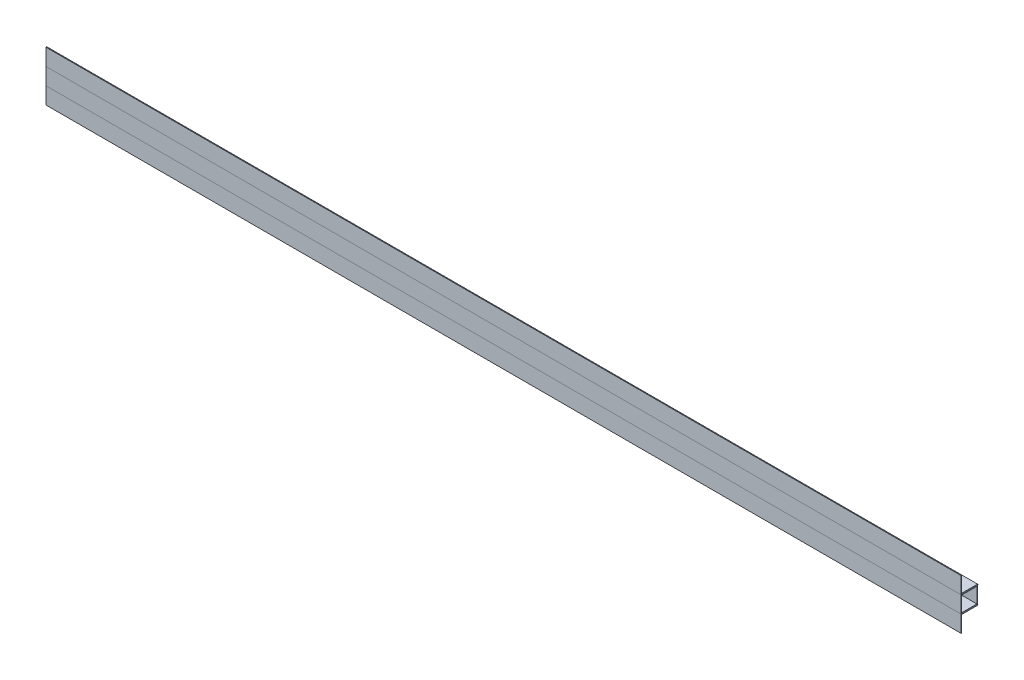
ISO-10303-21;
HEADER;
FILE_DESCRIPTION(('STEP AP214'),'2;1');
FILE_NAME('part.step','',(''),(''),'','','');
FILE_SCHEMA(('AUTOMOTIVE_DESIGN { 1 0 10303 214 1 1 1 1 }'));
ENDSEC;
DATA;
#1=APPLICATION_CONTEXT('core data for automotive mechanical design processes');
#2=APPLICATION_PROTOCOL_DEFINITION('international standard','automotive_design',2000,#1);
#3=PRODUCT_CONTEXT('',#1,'mechanical');
#4=PRODUCT('Part','Part','',(#3));
#5=PRODUCT_RELATED_PRODUCT_CATEGORY('part','',(#4));
#6=PRODUCT_DEFINITION_FORMATION('','',#4);
#7=PRODUCT_DEFINITION_CONTEXT('part definition',#1,'design');
#8=PRODUCT_DEFINITION('design','',#6,#7);
#9=PRODUCT_DEFINITION_SHAPE('','',#8);
#10=(LENGTH_UNIT() NAMED_UNIT(*) SI_UNIT(.MILLI.,.METRE.));
#11=(NAMED_UNIT(*) PLANE_ANGLE_UNIT() SI_UNIT($,.RADIAN.));
#12=(NAMED_UNIT(*) SI_UNIT($,.STERADIAN.) SOLID_ANGLE_UNIT());
#13=UNCERTAINTY_MEASURE_WITH_UNIT(LENGTH_MEASURE(1.E-05),#10,'distance_accuracy_value','');
#14=(GEOMETRIC_REPRESENTATION_CONTEXT(3) GLOBAL_UNCERTAINTY_ASSIGNED_CONTEXT((#13)) GLOBAL_UNIT_ASSIGNED_CONTEXT((#10,
#11,#12)) REPRESENTATION_CONTEXT('',''));
#15=CARTESIAN_POINT('',(0.,0.,0.));
#16=DIRECTION('',(0.,0.,1.));
#17=DIRECTION('',(1.,0.,0.));
#18=AXIS2_PLACEMENT_3D('',#15,#16,#17);
#19=CARTESIAN_POINT('',(1392.049939,-13.95,11.45));
#20=DIRECTION('',(0.,-1.,0.));
#21=DIRECTION('',(0.,0.,-1.));
#22=AXIS2_PLACEMENT_3D('',#19,#20,#21);
#23=PLANE('',#22);
#24=DIRECTION('',(0.,0.,1.));
#25=VECTOR('',#24,1.);
#26=CARTESIAN_POINT('',(0.,-13.95,11.45));
#27=LINE('',#26,#25);
#28=CARTESIAN_POINT('',(0.,-13.95,-12.7));
#29=VERTEX_POINT('',#28);
#30=CARTESIAN_POINT('',(0.,-13.95,11.45));
#31=VERTEX_POINT('',#30);
#32=EDGE_CURVE('E214',#29,#31,#27,.T.);
#33=ORIENTED_EDGE('',*,*,#32,.F.);
#34=DIRECTION('',(-1.,0.,0.));
#35=VECTOR('',#34,1.);
#36=CARTESIAN_POINT('',(1392.049939,-13.95,-12.7));
#37=LINE('',#36,#35);
#38=CARTESIAN_POINT('',(1392.049939,-13.95,-12.7));
#39=VERTEX_POINT('',#38);
#40=EDGE_CURVE('E14',#39,#29,#37,.T.);
#41=ORIENTED_EDGE('',*,*,#40,.F.);
#42=DIRECTION('',(0.,0.,1.));
#43=VECTOR('',#42,1.);
#44=CARTESIAN_POINT('',(1392.049939,-13.95,11.45));
#45=LINE('',#44,#43);
#46=CARTESIAN_POINT('',(1392.049939,-13.95,11.45));
#47=VERTEX_POINT('',#46);
#48=EDGE_CURVE('E234',#39,#47,#45,.T.);
#49=ORIENTED_EDGE('',*,*,#48,.T.);
#50=DIRECTION('',(-1.,0.,0.));
#51=VECTOR('',#50,1.);
#52=CARTESIAN_POINT('',(1392.049939,-13.95,11.45));
#53=LINE('',#52,#51);
#54=EDGE_CURVE('E120',#47,#31,#53,.T.);
#55=ORIENTED_EDGE('',*,*,#54,.T.);
#56=EDGE_LOOP('',(#33,#41,#49,#55));
#57=FACE_BOUND('',#56,.T.);
#58=ADVANCED_FACE('F117',(#57),#23,.T.);
#59=CARTESIAN_POINT('',(1392.049939,-13.325,-13.325));
#60=DIRECTION('',(0.,-0.707106781186546,-0.707106781186549));
#61=DIRECTION('',(0.,0.707106781186549,-0.707106781186546));
#62=AXIS2_PLACEMENT_3D('',#59,#60,#61);
#63=PLANE('',#62);
#64=DIRECTION('',(0.,-0.707106781186549,0.707106781186546));
#65=VECTOR('',#64,1.);
#66=CARTESIAN_POINT('',(0.,-13.325,-13.325));
#67=LINE('',#66,#65);
#68=CARTESIAN_POINT('',(0.,-13.325,-13.325));
#69=VERTEX_POINT('',#68);
#70=EDGE_CURVE('E232',#69,#29,#67,.T.);
#71=ORIENTED_EDGE('',*,*,#70,.F.);
#72=DIRECTION('',(-1.,0.,0.));
#73=VECTOR('',#72,1.);
#74=CARTESIAN_POINT('',(1392.049939,-13.325,-13.325));
#75=LINE('',#74,#73);
#76=CARTESIAN_POINT('',(1392.049939,-13.325,-13.325));
#77=VERTEX_POINT('',#76);
#78=EDGE_CURVE('E126',#77,#69,#75,.T.);
#79=ORIENTED_EDGE('',*,*,#78,.F.);
#80=DIRECTION('',(0.,-0.707106781186549,0.707106781186546));
#81=VECTOR('',#80,1.);
#82=CARTESIAN_POINT('',(1392.049939,-13.325,-13.325));
#83=LINE('',#82,#81);
#84=EDGE_CURVE('E204',#77,#39,#83,.T.);
#85=ORIENTED_EDGE('',*,*,#84,.T.);
#86=ORIENTED_EDGE('',*,*,#40,.T.);
#87=EDGE_LOOP('',(#71,#79,#85,#86));
#88=FACE_BOUND('',#87,.T.);
#89=ADVANCED_FACE('F246',(#88),#63,.T.);
#90=CARTESIAN_POINT('',(1392.049939,-13.325,-13.325));
#91=DIRECTION('',(0.,0.707106781186544,-0.707106781186551));
#92=DIRECTION('',(0.,0.707106781186551,0.707106781186544));
#93=AXIS2_PLACEMENT_3D('',#90,#91,#92);
#94=PLANE('',#93);
#95=DIRECTION('',(0.,-0.707106781186551,-0.707106781186544));
#96=VECTOR('',#95,1.);
#97=CARTESIAN_POINT('',(0.,-13.325,-13.325));
#98=LINE('',#97,#96);
#99=CARTESIAN_POINT('',(0.,-12.7,-12.7));
#100=VERTEX_POINT('',#99);
#101=EDGE_CURVE('E191',#100,#69,#98,.T.);
#102=ORIENTED_EDGE('',*,*,#101,.F.);
#103=DIRECTION('',(-1.,0.,0.));
#104=VECTOR('',#103,1.);
#105=CARTESIAN_POINT('',(1392.049939,-12.7,-12.7));
#106=LINE('',#105,#104);
#107=CARTESIAN_POINT('',(1392.049939,-12.7,-12.7));
#108=VERTEX_POINT('',#107);
#109=EDGE_CURVE('E186',#108,#100,#106,.T.);
#110=ORIENTED_EDGE('',*,*,#109,.F.);
#111=DIRECTION('',(0.,-0.707106781186551,-0.707106781186544));
#112=VECTOR('',#111,1.);
#113=CARTESIAN_POINT('',(1392.049939,-13.325,-13.325));
#114=LINE('',#113,#112);
#115=EDGE_CURVE('E189',#108,#77,#114,.T.);
#116=ORIENTED_EDGE('',*,*,#115,.T.);
#117=ORIENTED_EDGE('',*,*,#78,.T.);
#118=EDGE_LOOP('',(#102,#110,#116,#117));
#119=FACE_BOUND('',#118,.T.);
#120=ADVANCED_FACE('F188',(#119),#94,.T.);
#121=CARTESIAN_POINT('',(1392.049939,-12.7,-12.7));
#122=DIRECTION('',(0.,1.,0.));
#123=DIRECTION('',(0.,0.,1.));
#124=AXIS2_PLACEMENT_3D('',#121,#122,#123);
#125=PLANE('',#124);
#126=DIRECTION('',(0.,0.,-1.));
#127=VECTOR('',#126,1.);
#128=CARTESIAN_POINT('',(0.,-12.7,-12.7));
#129=LINE('',#128,#127);
#130=CARTESIAN_POINT('',(0.,-12.7,12.7));
#131=VERTEX_POINT('',#130);
#132=EDGE_CURVE('E229',#131,#100,#129,.T.);
#133=ORIENTED_EDGE('',*,*,#132,.F.);
#134=DIRECTION('',(-1.,0.,0.));
#135=VECTOR('',#134,1.);
#136=CARTESIAN_POINT('',(1392.049939,-12.7,12.7));
#137=LINE('',#136,#135);
#138=CARTESIAN_POINT('',(1392.049939,-12.7,12.7));
#139=VERTEX_POINT('',#138);
#140=EDGE_CURVE('E196',#139,#131,#137,.T.);
#141=ORIENTED_EDGE('',*,*,#140,.F.);
#142=DIRECTION('',(0.,0.,-1.));
#143=VECTOR('',#142,1.);
#144=CARTESIAN_POINT('',(1392.049939,-12.7,-12.7));
#145=LINE('',#144,#143);
#146=EDGE_CURVE('E202',#139,#108,#145,.T.);
#147=ORIENTED_EDGE('',*,*,#146,.T.);
#148=ORIENTED_EDGE('',*,*,#109,.T.);
#149=EDGE_LOOP('',(#133,#141,#147,#148));
#150=FACE_BOUND('',#149,.T.);
#151=ADVANCED_FACE('F206',(#150),#125,.T.);
#152=CARTESIAN_POINT('',(1392.049939,-12.7,12.7));
#153=DIRECTION('',(0.,0.,1.));
#154=DIRECTION('',(0.,-1.,0.));
#155=AXIS2_PLACEMENT_3D('',#152,#153,#154);
#156=PLANE('',#155);
#157=DIRECTION('',(0.,1.,0.));
#158=VECTOR('',#157,1.);
#159=CARTESIAN_POINT('',(0.,-12.7,12.7));
#160=LINE('',#159,#158);
#161=CARTESIAN_POINT('',(-1.77335599430191E-13,-38.1,12.7));
#162=VERTEX_POINT('',#161);
#163=EDGE_CURVE('E226',#162,#131,#160,.T.);
#164=ORIENTED_EDGE('',*,*,#163,.F.);
#165=DIRECTION('',(-1.,0.,0.));
#166=VECTOR('',#165,1.);
#167=CARTESIAN_POINT('',(1392.049939,-38.1,12.7));
#168=LINE('',#167,#166);
#169=CARTESIAN_POINT('',(1392.049939,-38.1,12.7));
#170=VERTEX_POINT('',#169);
#171=EDGE_CURVE('E238',#170,#162,#168,.T.);
#172=ORIENTED_EDGE('',*,*,#171,.F.);
#173=DIRECTION('',(0.,1.,0.));
#174=VECTOR('',#173,1.);
#175=CARTESIAN_POINT('',(1392.049939,-12.7,12.7));
#176=LINE('',#175,#174);
#177=EDGE_CURVE('E207',#170,#139,#176,.T.);
#178=ORIENTED_EDGE('',*,*,#177,.T.);
#179=ORIENTED_EDGE('',*,*,#140,.T.);
#180=EDGE_LOOP('',(#164,#172,#178,#179));
#181=FACE_BOUND('',#180,.T.);
#182=ADVANCED_FACE('F259',(#181),#156,.T.);
#183=CARTESIAN_POINT('',(1392.049939,-38.725,12.075));
#184=DIRECTION('',(0.,-0.707106781186547,0.707106781186548));
#185=DIRECTION('',(0.,-0.707106781186548,-0.707106781186547));
#186=AXIS2_PLACEMENT_3D('',#183,#184,#185);
#187=PLANE('',#186);
#188=DIRECTION('',(0.,0.707106781186548,0.707106781186547));
#189=VECTOR('',#188,1.);
#190=CARTESIAN_POINT('',(-1.81699172250816E-13,-38.725,12.075));
#191=LINE('',#190,#189);
#192=CARTESIAN_POINT('',(-1.81699172250816E-13,-38.725,12.075));
#193=VERTEX_POINT('',#192);
#194=EDGE_CURVE('E223',#193,#162,#191,.T.);
#195=ORIENTED_EDGE('',*,*,#194,.F.);
#196=DIRECTION('',(-1.,0.,0.));
#197=VECTOR('',#196,1.);
#198=CARTESIAN_POINT('',(1392.049939,-38.725,12.075));
#199=LINE('',#198,#197);
#200=CARTESIAN_POINT('',(1392.049939,-38.725,12.075));
#201=VERTEX_POINT('',#200);
#202=EDGE_CURVE('E240',#201,#193,#199,.T.);
#203=ORIENTED_EDGE('',*,*,#202,.F.);
#204=DIRECTION('',(0.,0.707106781186548,0.707106781186547));
#205=VECTOR('',#204,1.);
#206=CARTESIAN_POINT('',(1392.049939,-38.725,12.075));
#207=LINE('',#206,#205);
#208=EDGE_CURVE('E209',#201,#170,#207,.T.);
#209=ORIENTED_EDGE('',*,*,#208,.T.);
#210=ORIENTED_EDGE('',*,*,#171,.T.);
#211=EDGE_LOOP('',(#195,#203,#209,#210));
#212=FACE_BOUND('',#211,.T.);
#213=ADVANCED_FACE('F262',(#212),#187,.T.);
#214=CARTESIAN_POINT('',(1392.049939,-38.725,12.075));
#215=DIRECTION('',(0.,-0.707106781186547,-0.707106781186548));
#216=DIRECTION('',(0.,0.707106781186548,-0.707106781186547));
#217=AXIS2_PLACEMENT_3D('',#214,#215,#216);
#218=PLANE('',#217);
#219=DIRECTION('',(0.,-0.707106781186548,0.707106781186547));
#220=VECTOR('',#219,1.);
#221=CARTESIAN_POINT('',(-1.81699172250816E-13,-38.725,12.075));
#222=LINE('',#221,#220);
#223=CARTESIAN_POINT('',(-1.77335599430191E-13,-38.1,11.45));
#224=VERTEX_POINT('',#223);
#225=EDGE_CURVE('E220',#224,#193,#222,.T.);
#226=ORIENTED_EDGE('',*,*,#225,.F.);
#227=DIRECTION('',(-1.,0.,0.));
#228=VECTOR('',#227,1.);
#229=CARTESIAN_POINT('',(1392.049939,-38.1,11.45));
#230=LINE('',#229,#228);
#231=CARTESIAN_POINT('',(1392.049939,-38.1,11.45));
#232=VERTEX_POINT('',#231);
#233=EDGE_CURVE('E241',#232,#224,#230,.T.);
#234=ORIENTED_EDGE('',*,*,#233,.F.);
#235=DIRECTION('',(0.,-0.707106781186548,0.707106781186547));
#236=VECTOR('',#235,1.);
#237=CARTESIAN_POINT('',(1392.049939,-38.725,12.075));
#238=LINE('',#237,#236);
#239=EDGE_CURVE('E377',#232,#201,#238,.T.);
#240=ORIENTED_EDGE('',*,*,#239,.T.);
#241=ORIENTED_EDGE('',*,*,#202,.T.);
#242=EDGE_LOOP('',(#226,#234,#240,#241));
#243=FACE_BOUND('',#242,.T.);
#244=ADVANCED_FACE('F266',(#243),#218,.T.);
#245=CARTESIAN_POINT('',(1392.049939,-38.1,11.45));
#246=DIRECTION('',(0.,0.,-1.));
#247=DIRECTION('',(0.,1.,0.));
#248=AXIS2_PLACEMENT_3D('',#245,#246,#247);
#249=PLANE('',#248);
#250=DIRECTION('',(0.,-1.,0.));
#251=VECTOR('',#250,1.);
#252=CARTESIAN_POINT('',(-1.77335599430191E-13,-38.1,11.45));
#253=LINE('',#252,#251);
#254=EDGE_CURVE('E217',#31,#224,#253,.T.);
#255=ORIENTED_EDGE('',*,*,#254,.F.);
#256=ORIENTED_EDGE('',*,*,#54,.F.);
#257=DIRECTION('',(0.,-1.,0.));
#258=VECTOR('',#257,1.);
#259=CARTESIAN_POINT('',(1392.049939,-38.1,11.45));
#260=LINE('',#259,#258);
#261=EDGE_CURVE('E378',#47,#232,#260,.T.);
#262=ORIENTED_EDGE('',*,*,#261,.T.);
#263=ORIENTED_EDGE('',*,*,#233,.T.);
#264=EDGE_LOOP('',(#255,#256,#262,#263));
#265=FACE_BOUND('',#264,.T.);
#266=ADVANCED_FACE('F243',(#265),#249,.T.);
#267=CARTESIAN_POINT('',(1392.049939,0.,12.7));
#268=DIRECTION('',(-1.,0.,0.));
#269=DIRECTION('',(0.,1.,0.));
#270=AXIS2_PLACEMENT_3D('',#267,#268,#269);
#271=PLANE('',#270);
#272=ORIENTED_EDGE('',*,*,#48,.F.);
#273=ORIENTED_EDGE('',*,*,#84,.F.);
#274=ORIENTED_EDGE('',*,*,#115,.F.);
#275=ORIENTED_EDGE('',*,*,#146,.F.);
#276=ORIENTED_EDGE('',*,*,#177,.F.);
#277=ORIENTED_EDGE('',*,*,#208,.F.);
#278=ORIENTED_EDGE('',*,*,#239,.F.);
#279=ORIENTED_EDGE('',*,*,#261,.F.);
#280=EDGE_LOOP('',(#272,#273,#274,#275,#276,#277,#278,#279));
#281=FACE_BOUND('',#280,.T.);
#282=ADVANCED_FACE('F200',(#281),#271,.F.);
#283=CARTESIAN_POINT('',(0.,0.,12.7));
#284=DIRECTION('',(-1.,0.,0.));
#285=DIRECTION('',(0.,1.,0.));
#286=AXIS2_PLACEMENT_3D('',#283,#284,#285);
#287=PLANE('',#286);
#288=ORIENTED_EDGE('',*,*,#32,.T.);
#289=ORIENTED_EDGE('',*,*,#254,.T.);
#290=ORIENTED_EDGE('',*,*,#225,.T.);
#291=ORIENTED_EDGE('',*,*,#194,.T.);
#292=ORIENTED_EDGE('',*,*,#163,.T.);
#293=ORIENTED_EDGE('',*,*,#132,.T.);
#294=ORIENTED_EDGE('',*,*,#101,.T.);
#295=ORIENTED_EDGE('',*,*,#70,.T.);
#296=EDGE_LOOP('',(#288,#289,#290,#291,#292,#293,#294,#295));
#297=FACE_BOUND('',#296,.T.);
#298=ADVANCED_FACE('F245',(#297),#287,.T.);
#299=CLOSED_SHELL('',(#58,#89,#120,#151,#182,#213,#244,#266,#282,#298));
#300=MANIFOLD_SOLID_BREP('B2',#299);
#301=CARTESIAN_POINT('',(1392.049939,13.95,11.45));
#302=DIRECTION('',(0.,-1.,0.));
#303=DIRECTION('',(1.,0.,0.));
#304=AXIS2_PLACEMENT_3D('',#301,#302,#303);
#305=PLANE('',#304);
#306=DIRECTION('',(0.,0.,1.));
#307=VECTOR('',#306,1.);
#308=CARTESIAN_POINT('',(0.,13.95,11.45));
#309=LINE('',#308,#307);
#310=CARTESIAN_POINT('',(0.,13.95,-12.7));
#311=VERTEX_POINT('',#310);
#312=CARTESIAN_POINT('',(0.,13.95,11.45));
#313=VERTEX_POINT('',#312);
#314=EDGE_CURVE('E489',#311,#313,#309,.T.);
#315=ORIENTED_EDGE('',*,*,#314,.T.);
#316=DIRECTION('',(-1.,0.,0.));
#317=VECTOR('',#316,1.);
#318=CARTESIAN_POINT('',(1392.049939,13.95,11.45));
#319=LINE('',#318,#317);
#320=CARTESIAN_POINT('',(1392.049939,13.95,11.45));
#321=VERTEX_POINT('',#320);
#322=EDGE_CURVE('E115',#321,#313,#319,.T.);
#323=ORIENTED_EDGE('',*,*,#322,.F.);
#324=DIRECTION('',(0.,0.,1.));
#325=VECTOR('',#324,1.);
#326=CARTESIAN_POINT('',(1392.049939,13.95,11.45));
#327=LINE('',#326,#325);
#328=CARTESIAN_POINT('',(1392.049939,13.95,-12.7));
#329=VERTEX_POINT('',#328);
#330=EDGE_CURVE('E503',#329,#321,#327,.T.);
#331=ORIENTED_EDGE('',*,*,#330,.F.);
#332=DIRECTION('',(-1.,0.,0.));
#333=VECTOR('',#332,1.);
#334=CARTESIAN_POINT('',(1392.049939,13.95,-12.7));
#335=LINE('',#334,#333);
#336=EDGE_CURVE('E485',#329,#311,#335,.T.);
#337=ORIENTED_EDGE('',*,*,#336,.T.);
#338=EDGE_LOOP('',(#315,#323,#331,#337));
#339=FACE_BOUND('',#338,.T.);
#340=ADVANCED_FACE('F393',(#339),#305,.F.);
#341=CARTESIAN_POINT('',(1392.049939,38.1,11.45));
#342=DIRECTION('',(0.,0.,1.));
#343=DIRECTION('',(0.,-1.,0.));
#344=AXIS2_PLACEMENT_3D('',#341,#342,#343);
#345=PLANE('',#344);
#346=DIRECTION('',(0.,1.,0.));
#347=VECTOR('',#346,1.);
#348=CARTESIAN_POINT('',(0.,38.1,11.45));
#349=LINE('',#348,#347);
#350=CARTESIAN_POINT('',(0.,38.1,11.45));
#351=VERTEX_POINT('',#350);
#352=EDGE_CURVE('E492',#313,#351,#349,.T.);
#353=ORIENTED_EDGE('',*,*,#352,.T.);
#354=DIRECTION('',(-1.,0.,0.));
#355=VECTOR('',#354,1.);
#356=CARTESIAN_POINT('',(1392.049939,38.1,11.45));
#357=LINE('',#356,#355);
#358=CARTESIAN_POINT('',(1392.049939,38.1,11.45));
#359=VERTEX_POINT('',#358);
#360=EDGE_CURVE('E401',#359,#351,#357,.T.);
#361=ORIENTED_EDGE('',*,*,#360,.F.);
#362=DIRECTION('',(0.,1.,0.));
#363=VECTOR('',#362,1.);
#364=CARTESIAN_POINT('',(1392.049939,38.1,11.45));
#365=LINE('',#364,#363);
#366=EDGE_CURVE('E452',#321,#359,#365,.T.);
#367=ORIENTED_EDGE('',*,*,#366,.F.);
#368=ORIENTED_EDGE('',*,*,#322,.T.);
#369=EDGE_LOOP('',(#353,#361,#367,#368));
#370=FACE_BOUND('',#369,.T.);
#371=ADVANCED_FACE('F538',(#370),#345,.F.);
#372=CARTESIAN_POINT('',(1392.049939,38.725,12.075));
#373=DIRECTION('',(0.,-0.707106781186547,0.707106781186548));
#374=DIRECTION('',(0.,-0.707106781186548,-0.707106781186547));
#375=AXIS2_PLACEMENT_3D('',#372,#373,#374);
#376=PLANE('',#375);
#377=DIRECTION('',(0.,0.707106781186548,0.707106781186547));
#378=VECTOR('',#377,1.);
#379=CARTESIAN_POINT('',(0.,38.725,12.075));
#380=LINE('',#379,#378);
#381=CARTESIAN_POINT('',(0.,38.725,12.075));
#382=VERTEX_POINT('',#381);
#383=EDGE_CURVE('E494',#351,#382,#380,.T.);
#384=ORIENTED_EDGE('',*,*,#383,.T.);
#385=DIRECTION('',(-1.,0.,0.));
#386=VECTOR('',#385,1.);
#387=CARTESIAN_POINT('',(1392.049939,38.725,12.075));
#388=LINE('',#387,#386);
#389=CARTESIAN_POINT('',(1392.049939,38.725,12.075));
#390=VERTEX_POINT('',#389);
#391=EDGE_CURVE('E510',#390,#382,#388,.T.);
#392=ORIENTED_EDGE('',*,*,#391,.F.);
#393=DIRECTION('',(0.,0.707106781186548,0.707106781186547));
#394=VECTOR('',#393,1.);
#395=CARTESIAN_POINT('',(1392.049939,38.725,12.075));
#396=LINE('',#395,#394);
#397=EDGE_CURVE('E518',#359,#390,#396,.T.);
#398=ORIENTED_EDGE('',*,*,#397,.F.);
#399=ORIENTED_EDGE('',*,*,#360,.T.);
#400=EDGE_LOOP('',(#384,#392,#398,#399));
#401=FACE_BOUND('',#400,.T.);
#402=ADVANCED_FACE('F516',(#401),#376,.F.);
#403=CARTESIAN_POINT('',(1392.049939,38.725,12.075));
#404=DIRECTION('',(0.,-0.707106781186547,-0.707106781186548));
#405=DIRECTION('',(0.,0.707106781186548,-0.707106781186547));
#406=AXIS2_PLACEMENT_3D('',#403,#404,#405);
#407=PLANE('',#406);
#408=DIRECTION('',(0.,-0.707106781186548,0.707106781186547));
#409=VECTOR('',#408,1.);
#410=CARTESIAN_POINT('',(0.,38.725,12.075));
#411=LINE('',#410,#409);
#412=CARTESIAN_POINT('',(0.,38.1,12.7));
#413=VERTEX_POINT('',#412);
#414=EDGE_CURVE('E496',#382,#413,#411,.T.);
#415=ORIENTED_EDGE('',*,*,#414,.T.);
#416=DIRECTION('',(-1.,0.,0.));
#417=VECTOR('',#416,1.);
#418=CARTESIAN_POINT('',(1392.049939,38.1,12.7));
#419=LINE('',#418,#417);
#420=CARTESIAN_POINT('',(1392.049939,38.1,12.7));
#421=VERTEX_POINT('',#420);
#422=EDGE_CURVE('E507',#421,#413,#419,.T.);
#423=ORIENTED_EDGE('',*,*,#422,.F.);
#424=DIRECTION('',(0.,-0.707106781186548,0.707106781186547));
#425=VECTOR('',#424,1.);
#426=CARTESIAN_POINT('',(1392.049939,38.725,12.075));
#427=LINE('',#426,#425);
#428=EDGE_CURVE('E530',#390,#421,#427,.T.);
#429=ORIENTED_EDGE('',*,*,#428,.F.);
#430=ORIENTED_EDGE('',*,*,#391,.T.);
#431=EDGE_LOOP('',(#415,#423,#429,#430));
#432=FACE_BOUND('',#431,.T.);
#433=ADVANCED_FACE('F526',(#432),#407,.F.);
#434=CARTESIAN_POINT('',(1392.049939,12.7,12.7));
#435=DIRECTION('',(0.,0.,-1.));
#436=DIRECTION('',(0.,1.,0.));
#437=AXIS2_PLACEMENT_3D('',#434,#435,#436);
#438=PLANE('',#437);
#439=DIRECTION('',(0.,-1.,0.));
#440=VECTOR('',#439,1.);
#441=CARTESIAN_POINT('',(0.,12.7,12.7));
#442=LINE('',#441,#440);
#443=CARTESIAN_POINT('',(0.,12.7,12.7));
#444=VERTEX_POINT('',#443);
#445=EDGE_CURVE('E498',#413,#444,#442,.T.);
#446=ORIENTED_EDGE('',*,*,#445,.T.);
#447=DIRECTION('',(-1.,0.,0.));
#448=VECTOR('',#447,1.);
#449=CARTESIAN_POINT('',(1392.049939,12.7,12.7));
#450=LINE('',#449,#448);
#451=CARTESIAN_POINT('',(1392.049939,12.7,12.7));
#452=VERTEX_POINT('',#451);
#453=EDGE_CURVE('E480',#452,#444,#450,.T.);
#454=ORIENTED_EDGE('',*,*,#453,.F.);
#455=DIRECTION('',(0.,-1.,0.));
#456=VECTOR('',#455,1.);
#457=CARTESIAN_POINT('',(1392.049939,12.7,12.7));
#458=LINE('',#457,#456);
#459=EDGE_CURVE('E471',#421,#452,#458,.T.);
#460=ORIENTED_EDGE('',*,*,#459,.F.);
#461=ORIENTED_EDGE('',*,*,#422,.T.);
#462=EDGE_LOOP('',(#446,#454,#460,#461));
#463=FACE_BOUND('',#462,.T.);
#464=ADVANCED_FACE('F529',(#463),#438,.F.);
#465=CARTESIAN_POINT('',(1392.049939,12.7,-12.7));
#466=DIRECTION('',(0.,1.,0.));
#467=DIRECTION('',(-1.,0.,0.));
#468=AXIS2_PLACEMENT_3D('',#465,#466,#467);
#469=PLANE('',#468);
#470=DIRECTION('',(0.,0.,-1.));
#471=VECTOR('',#470,1.);
#472=CARTESIAN_POINT('',(0.,12.7,-12.7));
#473=LINE('',#472,#471);
#474=CARTESIAN_POINT('',(0.,12.7,-12.7));
#475=VERTEX_POINT('',#474);
#476=EDGE_CURVE('E479',#444,#475,#473,.T.);
#477=ORIENTED_EDGE('',*,*,#476,.T.);
#478=DIRECTION('',(-1.,0.,0.));
#479=VECTOR('',#478,1.);
#480=CARTESIAN_POINT('',(1392.049939,12.7,-12.7));
#481=LINE('',#480,#479);
#482=CARTESIAN_POINT('',(1392.049939,12.7,-12.7));
#483=VERTEX_POINT('',#482);
#484=EDGE_CURVE('E476',#483,#475,#481,.T.);
#485=ORIENTED_EDGE('',*,*,#484,.F.);
#486=DIRECTION('',(0.,0.,-1.));
#487=VECTOR('',#486,1.);
#488=CARTESIAN_POINT('',(1392.049939,12.7,-12.7));
#489=LINE('',#488,#487);
#490=EDGE_CURVE('E465',#452,#483,#489,.T.);
#491=ORIENTED_EDGE('',*,*,#490,.F.);
#492=ORIENTED_EDGE('',*,*,#453,.T.);
#493=EDGE_LOOP('',(#477,#485,#491,#492));
#494=FACE_BOUND('',#493,.T.);
#495=ADVANCED_FACE('F477',(#494),#469,.F.);
#496=CARTESIAN_POINT('',(1392.049939,13.325,-13.325));
#497=DIRECTION('',(0.,0.707106781186544,0.707106781186551));
#498=DIRECTION('',(0.,-0.707106781186551,0.707106781186544));
#499=AXIS2_PLACEMENT_3D('',#496,#497,#498);
#500=PLANE('',#499);
#501=DIRECTION('',(0.,0.707106781186551,-0.707106781186544));
#502=VECTOR('',#501,1.);
#503=CARTESIAN_POINT('',(0.,13.325,-13.325));
#504=LINE('',#503,#502);
#505=CARTESIAN_POINT('',(0.,13.325,-13.325));
#506=VERTEX_POINT('',#505);
#507=EDGE_CURVE('E438',#475,#506,#504,.T.);
#508=ORIENTED_EDGE('',*,*,#507,.T.);
#509=DIRECTION('',(-1.,0.,0.));
#510=VECTOR('',#509,1.);
#511=CARTESIAN_POINT('',(1392.049939,13.325,-13.325));
#512=LINE('',#511,#510);
#513=CARTESIAN_POINT('',(1392.049939,13.325,-13.325));
#514=VERTEX_POINT('',#513);
#515=EDGE_CURVE('E481',#514,#506,#512,.T.);
#516=ORIENTED_EDGE('',*,*,#515,.F.);
#517=DIRECTION('',(0.,0.707106781186551,-0.707106781186544));
#518=VECTOR('',#517,1.);
#519=CARTESIAN_POINT('',(1392.049939,13.325,-13.325));
#520=LINE('',#519,#518);
#521=EDGE_CURVE('E469',#483,#514,#520,.T.);
#522=ORIENTED_EDGE('',*,*,#521,.F.);
#523=ORIENTED_EDGE('',*,*,#484,.T.);
#524=EDGE_LOOP('',(#508,#516,#522,#523));
#525=FACE_BOUND('',#524,.T.);
#526=ADVANCED_FACE('F483',(#525),#500,.F.);
#527=CARTESIAN_POINT('',(1392.049939,13.325,-13.325));
#528=DIRECTION('',(0.,-0.707106781186546,0.707106781186549));
#529=DIRECTION('',(0.,-0.707106781186549,-0.707106781186546));
#530=AXIS2_PLACEMENT_3D('',#527,#528,#529);
#531=PLANE('',#530);
#532=DIRECTION('',(0.,0.707106781186549,0.707106781186546));
#533=VECTOR('',#532,1.);
#534=CARTESIAN_POINT('',(0.,13.325,-13.325));
#535=LINE('',#534,#533);
#536=EDGE_CURVE('E444',#506,#311,#535,.T.);
#537=ORIENTED_EDGE('',*,*,#536,.T.);
#538=ORIENTED_EDGE('',*,*,#336,.F.);
#539=DIRECTION('',(0.,0.707106781186549,0.707106781186546));
#540=VECTOR('',#539,1.);
#541=CARTESIAN_POINT('',(1392.049939,13.325,-13.325));
#542=LINE('',#541,#540);
#543=EDGE_CURVE('E409',#514,#329,#542,.T.);
#544=ORIENTED_EDGE('',*,*,#543,.F.);
#545=ORIENTED_EDGE('',*,*,#515,.T.);
#546=EDGE_LOOP('',(#537,#538,#544,#545));
#547=FACE_BOUND('',#546,.T.);
#548=ADVANCED_FACE('F554',(#547),#531,.F.);
#549=CARTESIAN_POINT('',(1392.049939,0.,12.7));
#550=DIRECTION('',(1.,0.,0.));
#551=DIRECTION('',(0.,1.,0.));
#552=AXIS2_PLACEMENT_3D('',#549,#550,#551);
#553=PLANE('',#552);
#554=ORIENTED_EDGE('',*,*,#330,.T.);
#555=ORIENTED_EDGE('',*,*,#366,.T.);
#556=ORIENTED_EDGE('',*,*,#397,.T.);
#557=ORIENTED_EDGE('',*,*,#428,.T.);
#558=ORIENTED_EDGE('',*,*,#459,.T.);
#559=ORIENTED_EDGE('',*,*,#490,.T.);
#560=ORIENTED_EDGE('',*,*,#521,.T.);
#561=ORIENTED_EDGE('',*,*,#543,.T.);
#562=EDGE_LOOP('',(#554,#555,#556,#557,#558,#559,#560,#561));
#563=FACE_BOUND('',#562,.T.);
#564=ADVANCED_FACE('F467',(#563),#553,.T.);
#565=CARTESIAN_POINT('',(0.,0.,12.7));
#566=DIRECTION('',(1.,0.,0.));
#567=DIRECTION('',(0.,1.,0.));
#568=AXIS2_PLACEMENT_3D('',#565,#566,#567);
#569=PLANE('',#568);
#570=ORIENTED_EDGE('',*,*,#314,.F.);
#571=ORIENTED_EDGE('',*,*,#536,.F.);
#572=ORIENTED_EDGE('',*,*,#507,.F.);
#573=ORIENTED_EDGE('',*,*,#476,.F.);
#574=ORIENTED_EDGE('',*,*,#445,.F.);
#575=ORIENTED_EDGE('',*,*,#414,.F.);
#576=ORIENTED_EDGE('',*,*,#383,.F.);
#577=ORIENTED_EDGE('',*,*,#352,.F.);
#578=EDGE_LOOP('',(#570,#571,#572,#573,#574,#575,#576,#577));
#579=FACE_BOUND('',#578,.T.);
#580=ADVANCED_FACE('F522',(#579),#569,.F.);
#581=CLOSED_SHELL('',(#340,#371,#402,#433,#464,#495,#526,#548,#564,#580));
#582=MANIFOLD_SOLID_BREP('B8',#581);
#583=CARTESIAN_POINT('',(1392.049939,12.7,-12.7));
#584=DIRECTION('',(0.,0.,1.));
#585=DIRECTION('',(1.,0.,0.));
#586=AXIS2_PLACEMENT_3D('',#583,#584,#585);
#587=PLANE('',#586);
#588=DIRECTION('',(0.,1.,0.));
#589=VECTOR('',#588,1.);
#590=CARTESIAN_POINT('',(0.,12.7,-12.7));
#591=LINE('',#590,#589);
#592=CARTESIAN_POINT('',(0.,-12.7,-12.7));
#593=VERTEX_POINT('',#592);
#594=CARTESIAN_POINT('',(0.,12.7,-12.7));
#595=VERTEX_POINT('',#594);
#596=EDGE_CURVE('E767',#593,#595,#591,.T.);
#597=ORIENTED_EDGE('',*,*,#596,.T.);
#598=DIRECTION('',(-1.,0.,0.));
#599=VECTOR('',#598,1.);
#600=CARTESIAN_POINT('',(1392.049939,12.7,-12.7));
#601=LINE('',#600,#599);
#602=CARTESIAN_POINT('',(1392.049939,12.7,-12.7));
#603=VERTEX_POINT('',#602);
#604=EDGE_CURVE('E391',#603,#595,#601,.T.);
#605=ORIENTED_EDGE('',*,*,#604,.F.);
#606=DIRECTION('',(0.,1.,0.));
#607=VECTOR('',#606,1.);
#608=CARTESIAN_POINT('',(1392.049939,12.7,-12.7));
#609=LINE('',#608,#607);
#610=CARTESIAN_POINT('',(1392.049939,-12.7,-12.7));
#611=VERTEX_POINT('',#610);
#612=EDGE_CURVE('E741',#611,#603,#609,.T.);
#613=ORIENTED_EDGE('',*,*,#612,.F.);
#614=DIRECTION('',(-1.,0.,0.));
#615=VECTOR('',#614,1.);
#616=CARTESIAN_POINT('',(1392.049939,-12.7,-12.7));
#617=LINE('',#616,#615);
#618=EDGE_CURVE('E774',#611,#593,#617,.T.);
#619=ORIENTED_EDGE('',*,*,#618,.T.);
#620=EDGE_LOOP('',(#597,#605,#613,#619));
#621=FACE_BOUND('',#620,.T.);
#622=ADVANCED_FACE('F660',(#621),#587,.F.);
#623=CARTESIAN_POINT('',(1392.049939,12.7,12.7));
#624=DIRECTION('',(0.,-1.,0.));
#625=DIRECTION('',(1.,0.,0.));
#626=AXIS2_PLACEMENT_3D('',#623,#624,#625);
#627=PLANE('',#626);
#628=DIRECTION('',(0.,0.,1.));
#629=VECTOR('',#628,1.);
#630=CARTESIAN_POINT('',(0.,12.7,12.7));
#631=LINE('',#630,#629);
#632=CARTESIAN_POINT('',(0.,12.7,12.7));
#633=VERTEX_POINT('',#632);
#634=EDGE_CURVE('E746',#595,#633,#631,.T.);
#635=ORIENTED_EDGE('',*,*,#634,.T.);
#636=DIRECTION('',(-1.,0.,0.));
#637=VECTOR('',#636,1.);
#638=CARTESIAN_POINT('',(1392.049939,12.7,12.7));
#639=LINE('',#638,#637);
#640=CARTESIAN_POINT('',(1392.049939,12.7,12.7));
#641=VERTEX_POINT('',#640);
#642=EDGE_CURVE('E670',#641,#633,#639,.T.);
#643=ORIENTED_EDGE('',*,*,#642,.F.);
#644=DIRECTION('',(0.,0.,1.));
#645=VECTOR('',#644,1.);
#646=CARTESIAN_POINT('',(1392.049939,12.7,12.7));
#647=LINE('',#646,#645);
#648=EDGE_CURVE('E735',#603,#641,#647,.T.);
#649=ORIENTED_EDGE('',*,*,#648,.F.);
#650=ORIENTED_EDGE('',*,*,#604,.T.);
#651=EDGE_LOOP('',(#635,#643,#649,#650));
#652=FACE_BOUND('',#651,.T.);
#653=ADVANCED_FACE('F745',(#652),#627,.F.);
#654=CARTESIAN_POINT('',(1392.049939,12.7,12.7));
#655=DIRECTION('',(0.,0.,-1.));
#656=DIRECTION('',(-1.,0.,0.));
#657=AXIS2_PLACEMENT_3D('',#654,#655,#656);
#658=PLANE('',#657);
#659=DIRECTION('',(0.,-1.,0.));
#660=VECTOR('',#659,1.);
#661=CARTESIAN_POINT('',(0.,12.7,12.7));
#662=LINE('',#661,#660);
#663=CARTESIAN_POINT('',(0.,-12.7,12.7));
#664=VERTEX_POINT('',#663);
#665=EDGE_CURVE('E708',#633,#664,#662,.T.);
#666=ORIENTED_EDGE('',*,*,#665,.T.);
#667=DIRECTION('',(-1.,0.,0.));
#668=VECTOR('',#667,1.);
#669=CARTESIAN_POINT('',(1392.049939,-12.7,12.7));
#670=LINE('',#669,#668);
#671=CARTESIAN_POINT('',(1392.049939,-12.7,12.7));
#672=VERTEX_POINT('',#671);
#673=EDGE_CURVE('E747',#672,#664,#670,.T.);
#674=ORIENTED_EDGE('',*,*,#673,.F.);
#675=DIRECTION('',(0.,-1.,0.));
#676=VECTOR('',#675,1.);
#677=CARTESIAN_POINT('',(1392.049939,12.7,12.7));
#678=LINE('',#677,#676);
#679=EDGE_CURVE('E739',#641,#672,#678,.T.);
#680=ORIENTED_EDGE('',*,*,#679,.F.);
#681=ORIENTED_EDGE('',*,*,#642,.T.);
#682=EDGE_LOOP('',(#666,#674,#680,#681));
#683=FACE_BOUND('',#682,.T.);
#684=ADVANCED_FACE('F749',(#683),#658,.F.);
#685=CARTESIAN_POINT('',(1392.049939,11.7,11.7));
#686=DIRECTION('',(0.,0.,-1.));
#687=DIRECTION('',(0.,1.,0.));
#688=AXIS2_PLACEMENT_3D('',#685,#686,#687);
#689=PLANE('',#688);
#690=DIRECTION('',(0.,-1.,0.));
#691=VECTOR('',#690,1.);
#692=CARTESIAN_POINT('',(0.,11.7,11.7));
#693=LINE('',#692,#691);
#694=CARTESIAN_POINT('',(0.,11.7,11.7));
#695=VERTEX_POINT('',#694);
#696=CARTESIAN_POINT('',(0.,-11.7,11.7));
#697=VERTEX_POINT('',#696);
#698=EDGE_CURVE('E755',#695,#697,#693,.T.);
#699=ORIENTED_EDGE('',*,*,#698,.F.);
#700=DIRECTION('',(-1.,0.,0.));
#701=VECTOR('',#700,1.);
#702=CARTESIAN_POINT('',(1392.049939,11.7,11.7));
#703=LINE('',#702,#701);
#704=CARTESIAN_POINT('',(1392.049939,11.7,11.7));
#705=VERTEX_POINT('',#704);
#706=EDGE_CURVE('E664',#705,#695,#703,.T.);
#707=ORIENTED_EDGE('',*,*,#706,.F.);
#708=DIRECTION('',(0.,-1.,0.));
#709=VECTOR('',#708,1.);
#710=CARTESIAN_POINT('',(1392.049939,11.7,11.7));
#711=LINE('',#710,#709);
#712=CARTESIAN_POINT('',(1392.049939,-11.7,11.7));
#713=VERTEX_POINT('',#712);
#714=EDGE_CURVE('E773',#705,#713,#711,.T.);
#715=ORIENTED_EDGE('',*,*,#714,.T.);
#716=DIRECTION('',(-1.,0.,0.));
#717=VECTOR('',#716,1.);
#718=CARTESIAN_POINT('',(1392.049939,-11.7,11.7));
#719=LINE('',#718,#717);
#720=EDGE_CURVE('E751',#713,#697,#719,.T.);
#721=ORIENTED_EDGE('',*,*,#720,.T.);
#722=EDGE_LOOP('',(#699,#707,#715,#721));
#723=FACE_BOUND('',#722,.T.);
#724=ADVANCED_FACE('F662',(#723),#689,.T.);
#725=CARTESIAN_POINT('',(1392.049939,11.7,11.7));
#726=DIRECTION('',(0.,-1.,0.));
#727=DIRECTION('',(1.,0.,0.));
#728=AXIS2_PLACEMENT_3D('',#725,#726,#727);
#729=PLANE('',#728);
#730=DIRECTION('',(0.,0.,1.));
#731=VECTOR('',#730,1.);
#732=CARTESIAN_POINT('',(0.,11.7,11.7));
#733=LINE('',#732,#731);
#734=CARTESIAN_POINT('',(0.,11.7,-11.7));
#735=VERTEX_POINT('',#734);
#736=EDGE_CURVE('E758',#735,#695,#733,.T.);
#737=ORIENTED_EDGE('',*,*,#736,.F.);
#738=DIRECTION('',(-1.,0.,0.));
#739=VECTOR('',#738,1.);
#740=CARTESIAN_POINT('',(1392.049939,11.7,-11.7));
#741=LINE('',#740,#739);
#742=CARTESIAN_POINT('',(1392.049939,11.7,-11.7));
#743=VERTEX_POINT('',#742);
#744=EDGE_CURVE('E779',#743,#735,#741,.T.);
#745=ORIENTED_EDGE('',*,*,#744,.F.);
#746=DIRECTION('',(0.,0.,1.));
#747=VECTOR('',#746,1.);
#748=CARTESIAN_POINT('',(1392.049939,11.7,11.7));
#749=LINE('',#748,#747);
#750=EDGE_CURVE('E788',#743,#705,#749,.T.);
#751=ORIENTED_EDGE('',*,*,#750,.T.);
#752=ORIENTED_EDGE('',*,*,#706,.T.);
#753=EDGE_LOOP('',(#737,#745,#751,#752));
#754=FACE_BOUND('',#753,.T.);
#755=ADVANCED_FACE('F786',(#754),#729,.T.);
#756=CARTESIAN_POINT('',(1392.049939,11.7,-11.7));
#757=DIRECTION('',(0.,0.,1.));
#758=DIRECTION('',(0.,-1.,0.));
#759=AXIS2_PLACEMENT_3D('',#756,#757,#758);
#760=PLANE('',#759);
#761=DIRECTION('',(0.,1.,0.));
#762=VECTOR('',#761,1.);
#763=CARTESIAN_POINT('',(0.,11.7,-11.7));
#764=LINE('',#763,#762);
#765=CARTESIAN_POINT('',(0.,-11.7,-11.7));
#766=VERTEX_POINT('',#765);
#767=EDGE_CURVE('E761',#766,#735,#764,.T.);
#768=ORIENTED_EDGE('',*,*,#767,.F.);
#769=DIRECTION('',(-1.,0.,0.));
#770=VECTOR('',#769,1.);
#771=CARTESIAN_POINT('',(1392.049939,-11.7,-11.7));
#772=LINE('',#771,#770);
#773=CARTESIAN_POINT('',(1392.049939,-11.7,-11.7));
#774=VERTEX_POINT('',#773);
#775=EDGE_CURVE('E778',#774,#766,#772,.T.);
#776=ORIENTED_EDGE('',*,*,#775,.F.);
#777=DIRECTION('',(0.,1.,0.));
#778=VECTOR('',#777,1.);
#779=CARTESIAN_POINT('',(1392.049939,11.7,-11.7));
#780=LINE('',#779,#778);
#781=EDGE_CURVE('E795',#774,#743,#780,.T.);
#782=ORIENTED_EDGE('',*,*,#781,.T.);
#783=ORIENTED_EDGE('',*,*,#744,.T.);
#784=EDGE_LOOP('',(#768,#776,#782,#783));
#785=FACE_BOUND('',#784,.T.);
#786=ADVANCED_FACE('F793',(#785),#760,.T.);
#787=CARTESIAN_POINT('',(1392.049939,-11.7,11.7));
#788=DIRECTION('',(0.,1.,0.));
#789=DIRECTION('',(-1.,0.,0.));
#790=AXIS2_PLACEMENT_3D('',#787,#788,#789);
#791=PLANE('',#790);
#792=DIRECTION('',(0.,0.,-1.));
#793=VECTOR('',#792,1.);
#794=CARTESIAN_POINT('',(0.,-11.7,11.7));
#795=LINE('',#794,#793);
#796=EDGE_CURVE('E764',#697,#766,#795,.T.);
#797=ORIENTED_EDGE('',*,*,#796,.F.);
#798=ORIENTED_EDGE('',*,*,#720,.F.);
#799=DIRECTION('',(0.,0.,-1.));
#800=VECTOR('',#799,1.);
#801=CARTESIAN_POINT('',(1392.049939,-11.7,11.7));
#802=LINE('',#801,#800);
#803=EDGE_CURVE('E800',#713,#774,#802,.T.);
#804=ORIENTED_EDGE('',*,*,#803,.T.);
#805=ORIENTED_EDGE('',*,*,#775,.T.);
#806=EDGE_LOOP('',(#797,#798,#804,#805));
#807=FACE_BOUND('',#806,.T.);
#808=ADVANCED_FACE('F802',(#807),#791,.T.);
#809=CARTESIAN_POINT('',(1392.049939,-12.7,12.7));
#810=DIRECTION('',(0.,1.,0.));
#811=DIRECTION('',(-1.,0.,0.));
#812=AXIS2_PLACEMENT_3D('',#809,#810,#811);
#813=PLANE('',#812);
#814=DIRECTION('',(0.,0.,-1.));
#815=VECTOR('',#814,1.);
#816=CARTESIAN_POINT('',(0.,-12.7,12.7));
#817=LINE('',#816,#815);
#818=EDGE_CURVE('E714',#664,#593,#817,.T.);
#819=ORIENTED_EDGE('',*,*,#818,.T.);
#820=ORIENTED_EDGE('',*,*,#618,.F.);
#821=DIRECTION('',(0.,0.,-1.));
#822=VECTOR('',#821,1.);
#823=CARTESIAN_POINT('',(1392.049939,-12.7,12.7));
#824=LINE('',#823,#822);
#825=EDGE_CURVE('E679',#672,#611,#824,.T.);
#826=ORIENTED_EDGE('',*,*,#825,.F.);
#827=ORIENTED_EDGE('',*,*,#673,.T.);
#828=EDGE_LOOP('',(#819,#820,#826,#827));
#829=FACE_BOUND('',#828,.T.);
#830=ADVANCED_FACE('F807',(#829),#813,.F.);
#831=CARTESIAN_POINT('',(1392.049939,0.,0.));
#832=DIRECTION('',(1.,0.,0.));
#833=DIRECTION('',(0.,1.,0.));
#834=AXIS2_PLACEMENT_3D('',#831,#832,#833);
#835=PLANE('',#834);
#836=ORIENTED_EDGE('',*,*,#714,.F.);
#837=ORIENTED_EDGE('',*,*,#750,.F.);
#838=ORIENTED_EDGE('',*,*,#781,.F.);
#839=ORIENTED_EDGE('',*,*,#803,.F.);
#840=EDGE_LOOP('',(#836,#837,#838,#839));
#841=FACE_BOUND('',#840,.T.);
#842=ORIENTED_EDGE('',*,*,#612,.T.);
#843=ORIENTED_EDGE('',*,*,#648,.T.);
#844=ORIENTED_EDGE('',*,*,#679,.T.);
#845=ORIENTED_EDGE('',*,*,#825,.T.);
#846=EDGE_LOOP('',(#842,#843,#844,#845));
#847=FACE_BOUND('',#846,.T.);
#848=ADVANCED_FACE('F737',(#841,#847),#835,.T.);
#849=CARTESIAN_POINT('',(0.,0.,0.));
#850=DIRECTION('',(1.,0.,0.));
#851=DIRECTION('',(0.,1.,0.));
#852=AXIS2_PLACEMENT_3D('',#849,#850,#851);
#853=PLANE('',#852);
#854=ORIENTED_EDGE('',*,*,#698,.T.);
#855=ORIENTED_EDGE('',*,*,#796,.T.);
#856=ORIENTED_EDGE('',*,*,#767,.T.);
#857=ORIENTED_EDGE('',*,*,#736,.T.);
#858=EDGE_LOOP('',(#854,#855,#856,#857));
#859=FACE_BOUND('',#858,.T.);
#860=ORIENTED_EDGE('',*,*,#596,.F.);
#861=ORIENTED_EDGE('',*,*,#818,.F.);
#862=ORIENTED_EDGE('',*,*,#665,.F.);
#863=ORIENTED_EDGE('',*,*,#634,.F.);
#864=EDGE_LOOP('',(#860,#861,#862,#863));
#865=FACE_BOUND('',#864,.T.);
#866=ADVANCED_FACE('F791',(#859,#865),#853,.F.);
#867=CLOSED_SHELL('',(#622,#653,#684,#724,#755,#786,#808,#830,#848,#866));
#868=MANIFOLD_SOLID_BREP('B109',#867);
#869=ADVANCED_BREP_SHAPE_REPRESENTATION('',(#18,#300,#582,#868),#14);
#870=SHAPE_DEFINITION_REPRESENTATION(#9,#869);
ENDSEC;
END-ISO-10303-21;
